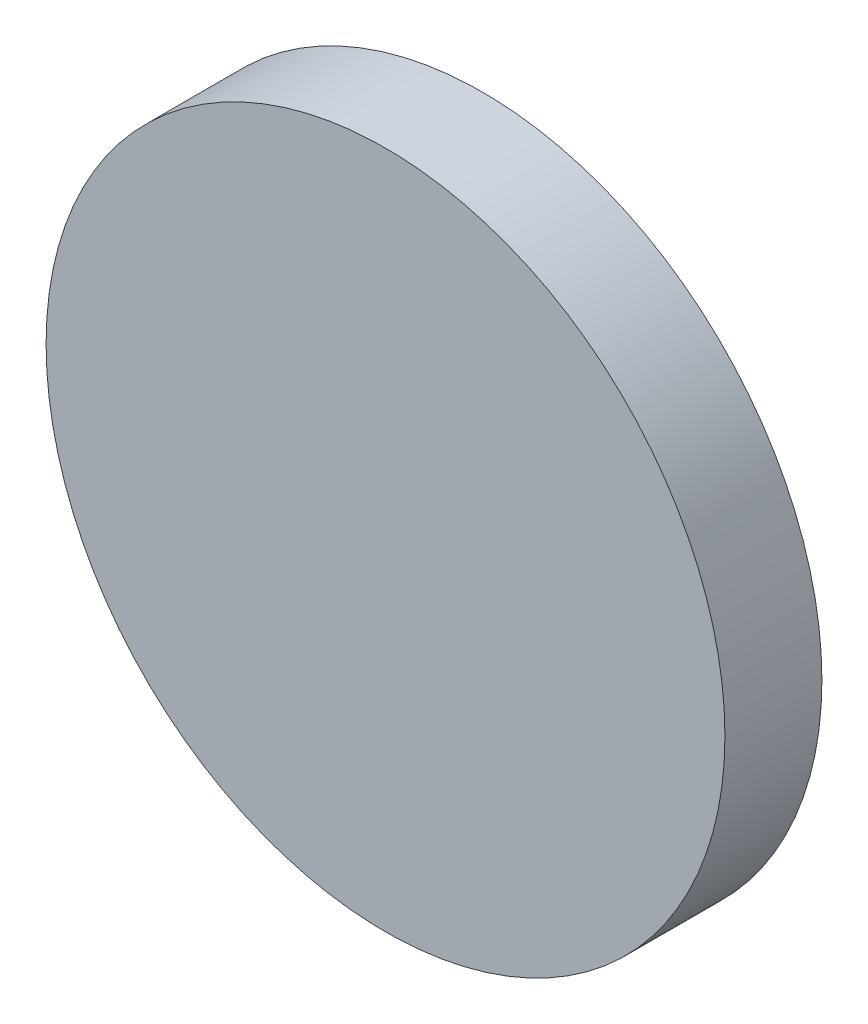
ISO-10303-21;
HEADER;
FILE_DESCRIPTION(('STEP AP214'),'2;1');
FILE_NAME('part.step','',(''),(''),'','','');
FILE_SCHEMA(('AUTOMOTIVE_DESIGN { 1 0 10303 214 1 1 1 1 }'));
ENDSEC;
DATA;
#1=APPLICATION_CONTEXT('core data for automotive mechanical design processes');
#2=APPLICATION_PROTOCOL_DEFINITION('international standard','automotive_design',2000,#1);
#3=PRODUCT_CONTEXT('',#1,'mechanical');
#4=PRODUCT('Part','Part','',(#3));
#5=PRODUCT_RELATED_PRODUCT_CATEGORY('part','',(#4));
#6=PRODUCT_DEFINITION_FORMATION('','',#4);
#7=PRODUCT_DEFINITION_CONTEXT('part definition',#1,'design');
#8=PRODUCT_DEFINITION('design','',#6,#7);
#9=PRODUCT_DEFINITION_SHAPE('','',#8);
#10=(LENGTH_UNIT() NAMED_UNIT(*) SI_UNIT(.MILLI.,.METRE.));
#11=(NAMED_UNIT(*) PLANE_ANGLE_UNIT() SI_UNIT($,.RADIAN.));
#12=(NAMED_UNIT(*) SI_UNIT($,.STERADIAN.) SOLID_ANGLE_UNIT());
#13=UNCERTAINTY_MEASURE_WITH_UNIT(LENGTH_MEASURE(1.E-05),#10,'distance_accuracy_value','');
#14=(GEOMETRIC_REPRESENTATION_CONTEXT(3) GLOBAL_UNCERTAINTY_ASSIGNED_CONTEXT((#13)) GLOBAL_UNIT_ASSIGNED_CONTEXT((#10,
#11,#12)) REPRESENTATION_CONTEXT('',''));
#15=CARTESIAN_POINT('',(0.,0.,0.));
#16=DIRECTION('',(0.,0.,1.));
#17=DIRECTION('',(1.,0.,0.));
#18=AXIS2_PLACEMENT_3D('',#15,#16,#17);
#19=CARTESIAN_POINT('',(0.,0.,2.));
#20=DIRECTION('',(0.,0.,-1.));
#21=DIRECTION('',(-1.,0.,0.));
#22=AXIS2_PLACEMENT_3D('',#19,#20,#21);
#23=CYLINDRICAL_SURFACE('',#22,7.);
#24=CARTESIAN_POINT('',(0.,0.,2.));
#25=DIRECTION('',(0.,0.,1.));
#26=DIRECTION('',(1.,0.,0.));
#27=AXIS2_PLACEMENT_3D('',#24,#25,#26);
#28=CIRCLE('',#27,7.);
#29=CARTESIAN_POINT('',(7.,0.,2.));
#30=VERTEX_POINT('',#29);
#31=EDGE_CURVE('E10',#30,#30,#28,.T.);
#32=ORIENTED_EDGE('',*,*,#31,.F.);
#33=EDGE_LOOP('',(#32));
#34=FACE_BOUND('',#33,.T.);
#35=CARTESIAN_POINT('',(0.,0.,0.));
#36=DIRECTION('',(0.,0.,1.));
#37=DIRECTION('',(1.,0.,0.));
#38=AXIS2_PLACEMENT_3D('',#35,#36,#37);
#39=CIRCLE('',#38,7.);
#40=CARTESIAN_POINT('',(7.,0.,0.));
#41=VERTEX_POINT('',#40);
#42=EDGE_CURVE('E40',#41,#41,#39,.T.);
#43=ORIENTED_EDGE('',*,*,#42,.T.);
#44=EDGE_LOOP('',(#43));
#45=FACE_BOUND('',#44,.T.);
#46=ADVANCED_FACE('F37',(#34,#45),#23,.T.);
#47=CARTESIAN_POINT('',(0.,0.,2.));
#48=DIRECTION('',(0.,0.,1.));
#49=DIRECTION('',(1.,0.,0.));
#50=AXIS2_PLACEMENT_3D('',#47,#48,#49);
#51=PLANE('',#50);
#52=ORIENTED_EDGE('',*,*,#31,.T.);
#53=EDGE_LOOP('',(#52));
#54=FACE_BOUND('',#53,.T.);
#55=ADVANCED_FACE('F52',(#54),#51,.T.);
#56=CARTESIAN_POINT('',(0.,0.,0.));
#57=DIRECTION('',(0.,0.,1.));
#58=DIRECTION('',(1.,0.,0.));
#59=AXIS2_PLACEMENT_3D('',#56,#57,#58);
#60=PLANE('',#59);
#61=ORIENTED_EDGE('',*,*,#42,.F.);
#62=EDGE_LOOP('',(#61));
#63=FACE_BOUND('',#62,.T.);
#64=ADVANCED_FACE('F50',(#63),#60,.F.);
#65=CLOSED_SHELL('',(#46,#55,#64));
#66=MANIFOLD_SOLID_BREP('B2',#65);
#67=ADVANCED_BREP_SHAPE_REPRESENTATION('',(#18,#66),#14);
#68=SHAPE_DEFINITION_REPRESENTATION(#9,#67);
ENDSEC;
END-ISO-10303-21;
